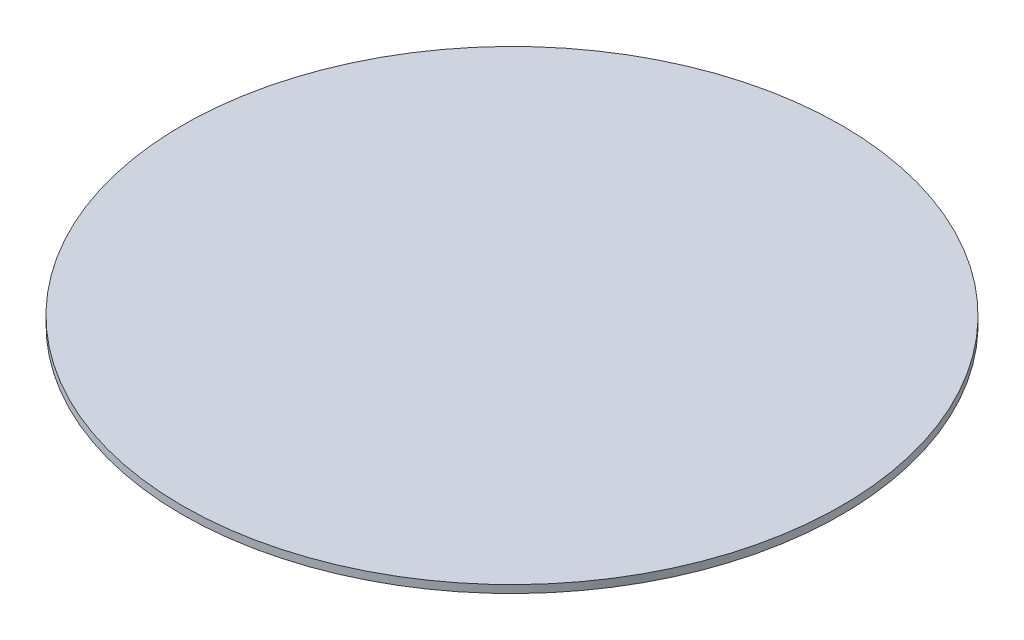
ISO-10303-21;
HEADER;
FILE_DESCRIPTION(('STEP AP214'),'2;1');
FILE_NAME('part.step','',(''),(''),'','','');
FILE_SCHEMA(('AUTOMOTIVE_DESIGN { 1 0 10303 214 1 1 1 1 }'));
ENDSEC;
DATA;
#1=APPLICATION_CONTEXT('core data for automotive mechanical design processes');
#2=APPLICATION_PROTOCOL_DEFINITION('international standard','automotive_design',2000,#1);
#3=PRODUCT_CONTEXT('',#1,'mechanical');
#4=PRODUCT('Part','Part','',(#3));
#5=PRODUCT_RELATED_PRODUCT_CATEGORY('part','',(#4));
#6=PRODUCT_DEFINITION_FORMATION('','',#4);
#7=PRODUCT_DEFINITION_CONTEXT('part definition',#1,'design');
#8=PRODUCT_DEFINITION('design','',#6,#7);
#9=PRODUCT_DEFINITION_SHAPE('','',#8);
#10=(LENGTH_UNIT() NAMED_UNIT(*) SI_UNIT(.MILLI.,.METRE.));
#11=(NAMED_UNIT(*) PLANE_ANGLE_UNIT() SI_UNIT($,.RADIAN.));
#12=(NAMED_UNIT(*) SI_UNIT($,.STERADIAN.) SOLID_ANGLE_UNIT());
#13=UNCERTAINTY_MEASURE_WITH_UNIT(LENGTH_MEASURE(1.E-05),#10,'distance_accuracy_value','');
#14=(GEOMETRIC_REPRESENTATION_CONTEXT(3) GLOBAL_UNCERTAINTY_ASSIGNED_CONTEXT((#13)) GLOBAL_UNIT_ASSIGNED_CONTEXT((#10,
#11,#12)) REPRESENTATION_CONTEXT('',''));
#15=CARTESIAN_POINT('',(0.,0.,0.));
#16=DIRECTION('',(0.,0.,1.));
#17=DIRECTION('',(1.,0.,0.));
#18=AXIS2_PLACEMENT_3D('',#15,#16,#17);
#19=CARTESIAN_POINT('',(0.,0.8,0.));
#20=DIRECTION('',(0.,-1.,0.));
#21=DIRECTION('',(0.,0.,-1.));
#22=AXIS2_PLACEMENT_3D('',#19,#20,#21);
#23=CYLINDRICAL_SURFACE('',#22,34.);
#24=CARTESIAN_POINT('',(0.,0.8,0.));
#25=DIRECTION('',(0.,1.,0.));
#26=DIRECTION('',(0.,0.,1.));
#27=AXIS2_PLACEMENT_3D('',#24,#25,#26);
#28=CIRCLE('',#27,34.);
#29=CARTESIAN_POINT('',(0.,0.8,34.));
#30=VERTEX_POINT('',#29);
#31=EDGE_CURVE('E10',#30,#30,#28,.T.);
#32=ORIENTED_EDGE('',*,*,#31,.F.);
#33=EDGE_LOOP('',(#32));
#34=FACE_BOUND('',#33,.T.);
#35=CARTESIAN_POINT('',(0.,0.,0.));
#36=DIRECTION('',(0.,1.,0.));
#37=DIRECTION('',(0.,0.,1.));
#38=AXIS2_PLACEMENT_3D('',#35,#36,#37);
#39=CIRCLE('',#38,34.);
#40=CARTESIAN_POINT('',(0.,0.,34.));
#41=VERTEX_POINT('',#40);
#42=EDGE_CURVE('E46',#41,#41,#39,.T.);
#43=ORIENTED_EDGE('',*,*,#42,.T.);
#44=EDGE_LOOP('',(#43));
#45=FACE_BOUND('',#44,.T.);
#46=ADVANCED_FACE('F43',(#34,#45),#23,.T.);
#47=CARTESIAN_POINT('',(0.,0.8,0.));
#48=DIRECTION('',(0.,1.,0.));
#49=DIRECTION('',(0.,0.,1.));
#50=AXIS2_PLACEMENT_3D('',#47,#48,#49);
#51=PLANE('',#50);
#52=ORIENTED_EDGE('',*,*,#31,.T.);
#53=EDGE_LOOP('',(#52));
#54=FACE_BOUND('',#53,.T.);
#55=ADVANCED_FACE('F60',(#54),#51,.T.);
#56=CARTESIAN_POINT('',(0.,0.,0.));
#57=DIRECTION('',(0.,1.,0.));
#58=DIRECTION('',(0.,0.,1.));
#59=AXIS2_PLACEMENT_3D('',#56,#57,#58);
#60=PLANE('',#59);
#61=ORIENTED_EDGE('',*,*,#42,.F.);
#62=EDGE_LOOP('',(#61));
#63=FACE_BOUND('',#62,.T.);
#64=ADVANCED_FACE('F58',(#63),#60,.F.);
#65=CLOSED_SHELL('',(#46,#55,#64));
#66=MANIFOLD_SOLID_BREP('B2',#65);
#67=ADVANCED_BREP_SHAPE_REPRESENTATION('',(#18,#66),#14);
#68=SHAPE_DEFINITION_REPRESENTATION(#9,#67);
ENDSEC;
END-ISO-10303-21;
